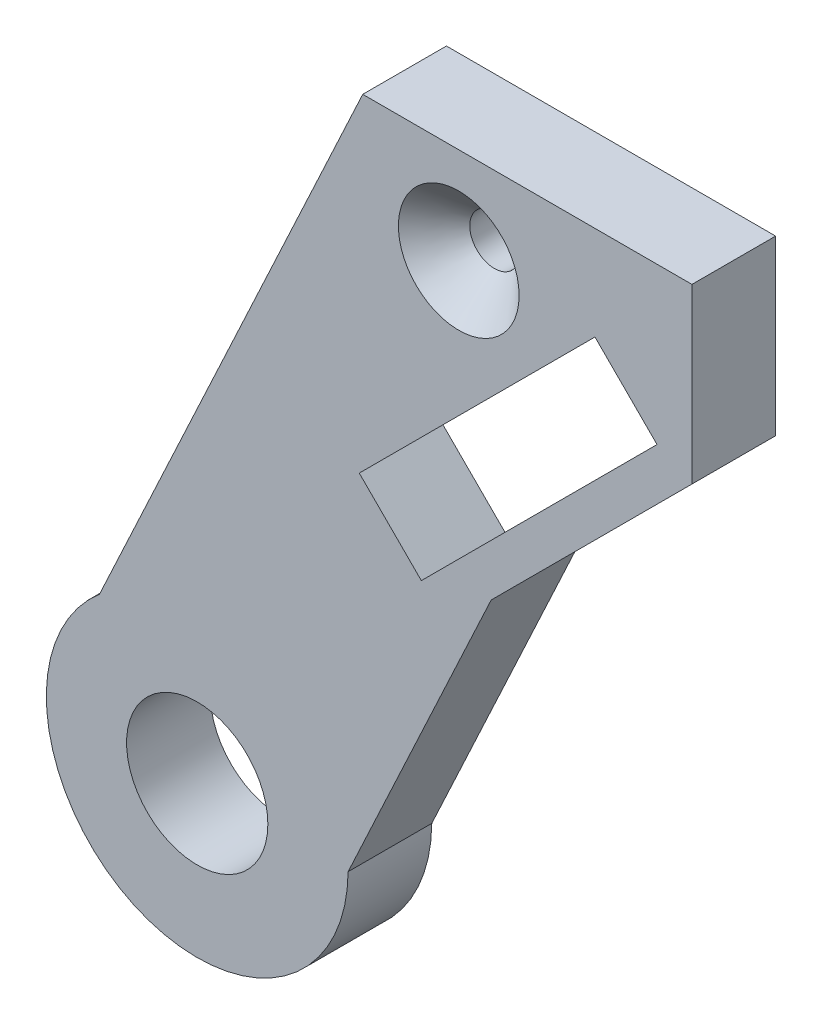
ISO-10303-21;
HEADER;
FILE_DESCRIPTION(('STEP AP214'),'2;1');
FILE_NAME('part.step','',(''),(''),'','','');
FILE_SCHEMA(('AUTOMOTIVE_DESIGN { 1 0 10303 214 1 1 1 1 }'));
ENDSEC;
DATA;
#1=APPLICATION_CONTEXT('core data for automotive mechanical design processes');
#2=APPLICATION_PROTOCOL_DEFINITION('international standard','automotive_design',2000,#1);
#3=PRODUCT_CONTEXT('',#1,'mechanical');
#4=PRODUCT('Part','Part','',(#3));
#5=PRODUCT_RELATED_PRODUCT_CATEGORY('part','',(#4));
#6=PRODUCT_DEFINITION_FORMATION('','',#4);
#7=PRODUCT_DEFINITION_CONTEXT('part definition',#1,'design');
#8=PRODUCT_DEFINITION('design','',#6,#7);
#9=PRODUCT_DEFINITION_SHAPE('','',#8);
#10=(LENGTH_UNIT() NAMED_UNIT(*) SI_UNIT(.MILLI.,.METRE.));
#11=(NAMED_UNIT(*) PLANE_ANGLE_UNIT() SI_UNIT($,.RADIAN.));
#12=(NAMED_UNIT(*) SI_UNIT($,.STERADIAN.) SOLID_ANGLE_UNIT());
#13=UNCERTAINTY_MEASURE_WITH_UNIT(LENGTH_MEASURE(1.E-05),#10,'distance_accuracy_value','');
#14=(GEOMETRIC_REPRESENTATION_CONTEXT(3) GLOBAL_UNCERTAINTY_ASSIGNED_CONTEXT((#13)) GLOBAL_UNIT_ASSIGNED_CONTEXT((#10,
#11,#12)) REPRESENTATION_CONTEXT('',''));
#15=CARTESIAN_POINT('',(0.,0.,0.));
#16=DIRECTION('',(0.,0.,1.));
#17=DIRECTION('',(1.,0.,0.));
#18=AXIS2_PLACEMENT_3D('',#15,#16,#17);
#19=CARTESIAN_POINT('',(3.5,-3.5,3.05));
#20=DIRECTION('',(0.,0.,-1.));
#21=DIRECTION('',(-1.,0.,0.));
#22=AXIS2_PLACEMENT_3D('',#19,#20,#21);
#23=CYLINDRICAL_SURFACE('',#22,0.9);
#24=CARTESIAN_POINT('',(3.5,-3.5,0.));
#25=DIRECTION('',(0.,0.,-1.));
#26=DIRECTION('',(1.,0.,0.));
#27=AXIS2_PLACEMENT_3D('',#24,#25,#26);
#28=CIRCLE('',#27,0.9);
#29=CARTESIAN_POINT('',(4.4,-3.5,0.));
#30=VERTEX_POINT('',#29);
#31=EDGE_CURVE('E159',#30,#30,#28,.T.);
#32=ORIENTED_EDGE('',*,*,#31,.T.);
#33=EDGE_LOOP('',(#32));
#34=FACE_BOUND('',#33,.T.);
#35=CARTESIAN_POINT('',(3.5,-3.5,1.74999999999999));
#36=DIRECTION('',(0.,0.,-1.));
#37=DIRECTION('',(1.,0.,0.));
#38=AXIS2_PLACEMENT_3D('',#35,#36,#37);
#39=CIRCLE('',#38,0.899999999999988);
#40=CARTESIAN_POINT('',(4.39999999999999,-3.5,1.74999999999999));
#41=VERTEX_POINT('',#40);
#42=EDGE_CURVE('E163',#41,#41,#39,.T.);
#43=ORIENTED_EDGE('',*,*,#42,.F.);
#44=EDGE_LOOP('',(#43));
#45=FACE_BOUND('',#44,.T.);
#46=ADVANCED_FACE('F43',(#34,#45),#23,.F.);
#47=CARTESIAN_POINT('',(-6.03391760833418,-24.7707859846198,3.05));
#48=DIRECTION('',(0.,0.,-1.));
#49=DIRECTION('',(-1.,0.,0.));
#50=AXIS2_PLACEMENT_3D('',#47,#48,#49);
#51=CYLINDRICAL_SURFACE('',#50,5.49999999999981);
#52=CARTESIAN_POINT('',(-6.03391760833418,-24.7707859846198,0.));
#53=DIRECTION('',(0.,0.,-1.));
#54=DIRECTION('',(1.,0.,0.));
#55=AXIS2_PLACEMENT_3D('',#52,#53,#54);
#56=CIRCLE('',#55,5.49999999999981);
#57=CARTESIAN_POINT('',(-0.534038585902411,-24.8072652748118,0.));
#58=VERTEX_POINT('',#57);
#59=CARTESIAN_POINT('',(-9.59711645626916,-20.5810826574052,0.));
#60=VERTEX_POINT('',#59);
#61=EDGE_CURVE('E174',#58,#60,#56,.T.);
#62=ORIENTED_EDGE('',*,*,#61,.F.);
#63=DIRECTION('',(0.,0.,-1.));
#64=VECTOR('',#63,1.);
#65=CARTESIAN_POINT('',(-0.534038585902411,-24.8072652748118,3.05));
#66=LINE('',#65,#64);
#67=CARTESIAN_POINT('',(-0.534038585902411,-24.8072652748118,3.05));
#68=VERTEX_POINT('',#67);
#69=EDGE_CURVE('E189',#68,#58,#66,.T.);
#70=ORIENTED_EDGE('',*,*,#69,.F.);
#71=CARTESIAN_POINT('',(-6.03391760833418,-24.7707859846198,3.05));
#72=DIRECTION('',(0.,0.,-1.));
#73=DIRECTION('',(1.,0.,0.));
#74=AXIS2_PLACEMENT_3D('',#71,#72,#73);
#75=CIRCLE('',#74,5.49999999999981);
#76=CARTESIAN_POINT('',(-9.59711645626916,-20.5810826574052,3.05));
#77=VERTEX_POINT('',#76);
#78=EDGE_CURVE('E216',#68,#77,#75,.T.);
#79=ORIENTED_EDGE('',*,*,#78,.T.);
#80=DIRECTION('',(0.,0.,-1.));
#81=VECTOR('',#80,1.);
#82=CARTESIAN_POINT('',(-9.59711645626916,-20.5810826574052,3.05));
#83=LINE('',#82,#81);
#84=EDGE_CURVE('E11',#77,#60,#83,.T.);
#85=ORIENTED_EDGE('',*,*,#84,.T.);
#86=EDGE_LOOP('',(#62,#70,#79,#85));
#87=FACE_BOUND('',#86,.T.);
#88=ADVANCED_FACE('F235',(#87),#51,.T.);
#89=CARTESIAN_POINT('',(0.,0.,3.05));
#90=DIRECTION('',(-0.906307787036648,0.422618261740703,0.));
#91=DIRECTION('',(0.422618261740703,0.906307787036648,0.));
#92=AXIS2_PLACEMENT_3D('',#89,#90,#91);
#93=PLANE('',#92);
#94=DIRECTION('',(-0.422618261740703,-0.906307787036648,0.));
#95=VECTOR('',#94,1.);
#96=CARTESIAN_POINT('',(0.,0.,0.));
#97=LINE('',#96,#95);
#98=CARTESIAN_POINT('',(0.,0.,0.));
#99=VERTEX_POINT('',#98);
#100=EDGE_CURVE('E176',#99,#60,#97,.T.);
#101=ORIENTED_EDGE('',*,*,#100,.T.);
#102=ORIENTED_EDGE('',*,*,#84,.F.);
#103=DIRECTION('',(-0.422618261740703,-0.906307787036648,0.));
#104=VECTOR('',#103,1.);
#105=CARTESIAN_POINT('',(0.,0.,3.05));
#106=LINE('',#105,#104);
#107=CARTESIAN_POINT('',(0.,0.,3.05));
#108=VERTEX_POINT('',#107);
#109=EDGE_CURVE('E150',#108,#77,#106,.T.);
#110=ORIENTED_EDGE('',*,*,#109,.F.);
#111=DIRECTION('',(0.,0.,-1.));
#112=VECTOR('',#111,1.);
#113=CARTESIAN_POINT('',(0.,0.,3.05));
#114=LINE('',#113,#112);
#115=EDGE_CURVE('E52',#108,#99,#114,.T.);
#116=ORIENTED_EDGE('',*,*,#115,.T.);
#117=EDGE_LOOP('',(#101,#102,#110,#116));
#118=FACE_BOUND('',#117,.T.);
#119=ADVANCED_FACE('F231',(#118),#93,.T.);
#120=CARTESIAN_POINT('',(0.,0.,3.05));
#121=DIRECTION('',(0.,-1.,0.));
#122=DIRECTION('',(0.,0.,1.));
#123=AXIS2_PLACEMENT_3D('',#120,#121,#122);
#124=PLANE('',#123);
#125=DIRECTION('',(1.,0.,0.));
#126=VECTOR('',#125,1.);
#127=CARTESIAN_POINT('',(0.,0.,0.));
#128=LINE('',#127,#126);
#129=CARTESIAN_POINT('',(12.,0.,0.));
#130=VERTEX_POINT('',#129);
#131=EDGE_CURVE('E178',#99,#130,#128,.T.);
#132=ORIENTED_EDGE('',*,*,#131,.F.);
#133=ORIENTED_EDGE('',*,*,#115,.F.);
#134=DIRECTION('',(1.,0.,0.));
#135=VECTOR('',#134,1.);
#136=CARTESIAN_POINT('',(0.,0.,3.05));
#137=LINE('',#136,#135);
#138=CARTESIAN_POINT('',(12.,0.,3.05));
#139=VERTEX_POINT('',#138);
#140=EDGE_CURVE('E148',#108,#139,#137,.T.);
#141=ORIENTED_EDGE('',*,*,#140,.T.);
#142=DIRECTION('',(0.,0.,-1.));
#143=VECTOR('',#142,1.);
#144=CARTESIAN_POINT('',(12.,0.,3.05));
#145=LINE('',#144,#143);
#146=EDGE_CURVE('E142',#139,#130,#145,.T.);
#147=ORIENTED_EDGE('',*,*,#146,.T.);
#148=EDGE_LOOP('',(#132,#133,#141,#147));
#149=FACE_BOUND('',#148,.T.);
#150=ADVANCED_FACE('F349',(#149),#124,.F.);
#151=CARTESIAN_POINT('',(12.,0.,3.05));
#152=DIRECTION('',(-1.,0.,0.));
#153=DIRECTION('',(0.,0.,1.));
#154=AXIS2_PLACEMENT_3D('',#151,#152,#153);
#155=PLANE('',#154);
#156=DIRECTION('',(0.,-1.,0.));
#157=VECTOR('',#156,1.);
#158=CARTESIAN_POINT('',(12.,0.,0.));
#159=LINE('',#158,#157);
#160=CARTESIAN_POINT('',(12.,-6.3039086153561,0.));
#161=VERTEX_POINT('',#160);
#162=EDGE_CURVE('E181',#130,#161,#159,.T.);
#163=ORIENTED_EDGE('',*,*,#162,.F.);
#164=ORIENTED_EDGE('',*,*,#146,.F.);
#165=DIRECTION('',(0.,-1.,0.));
#166=VECTOR('',#165,1.);
#167=CARTESIAN_POINT('',(12.,0.,3.05));
#168=LINE('',#167,#166);
#169=CARTESIAN_POINT('',(12.,-6.3039086153561,3.05));
#170=VERTEX_POINT('',#169);
#171=EDGE_CURVE('E132',#139,#170,#168,.T.);
#172=ORIENTED_EDGE('',*,*,#171,.T.);
#173=DIRECTION('',(0.,0.,-1.));
#174=VECTOR('',#173,1.);
#175=CARTESIAN_POINT('',(12.,-6.3039086153561,3.05));
#176=LINE('',#175,#174);
#177=EDGE_CURVE('E137',#170,#161,#176,.T.);
#178=ORIENTED_EDGE('',*,*,#177,.T.);
#179=EDGE_LOOP('',(#163,#164,#172,#178));
#180=FACE_BOUND('',#179,.T.);
#181=ADVANCED_FACE('F145',(#180),#155,.F.);
#182=CARTESIAN_POINT('',(9.15195430767813,-9.15195430767801,3.05));
#183=DIRECTION('',(0.707106781186552,-0.707106781186543,0.));
#184=DIRECTION('',(-0.707106781186543,-0.707106781186552,0.));
#185=AXIS2_PLACEMENT_3D('',#182,#183,#184);
#186=PLANE('',#185);
#187=DIRECTION('',(0.707106781186543,0.707106781186552,0.));
#188=VECTOR('',#187,1.);
#189=CARTESIAN_POINT('',(9.15195430767813,-9.15195430767801,0.));
#190=LINE('',#189,#188);
#191=CARTESIAN_POINT('',(4.68158568563559,-13.6223229297206,0.));
#192=VERTEX_POINT('',#191);
#193=EDGE_CURVE('E139',#192,#161,#190,.T.);
#194=ORIENTED_EDGE('',*,*,#193,.T.);
#195=ORIENTED_EDGE('',*,*,#177,.F.);
#196=DIRECTION('',(0.707106781186543,0.707106781186552,0.));
#197=VECTOR('',#196,1.);
#198=CARTESIAN_POINT('',(9.15195430767813,-9.15195430767801,3.05));
#199=LINE('',#198,#197);
#200=CARTESIAN_POINT('',(4.68158568563559,-13.6223229297206,3.05));
#201=VERTEX_POINT('',#200);
#202=EDGE_CURVE('E127',#201,#170,#199,.T.);
#203=ORIENTED_EDGE('',*,*,#202,.F.);
#204=DIRECTION('',(0.,0.,-1.));
#205=VECTOR('',#204,1.);
#206=CARTESIAN_POINT('',(4.68158568563559,-13.6223229297206,3.05));
#207=LINE('',#206,#205);
#208=EDGE_CURVE('E143',#201,#192,#207,.T.);
#209=ORIENTED_EDGE('',*,*,#208,.T.);
#210=EDGE_LOOP('',(#194,#195,#203,#209));
#211=FACE_BOUND('',#210,.T.);
#212=ADVANCED_FACE('F138',(#211),#186,.T.);
#213=CARTESIAN_POINT('',(2.51749910265625,2.51749910265625,3.05));
#214=DIRECTION('',(-0.707106781186548,-0.707106781186548,0.));
#215=DIRECTION('',(-0.707106781186548,0.707106781186548,0.));
#216=AXIS2_PLACEMENT_3D('',#213,#214,#215);
#217=PLANE('',#216);
#218=DIRECTION('',(0.707106781186548,-0.707106781186548,0.));
#219=VECTOR('',#218,1.);
#220=CARTESIAN_POINT('',(2.51749910265625,2.51749910265625,0.));
#221=LINE('',#220,#219);
#222=CARTESIAN_POINT('',(8.46446609406726,-3.42946788875476,0.));
#223=VERTEX_POINT('',#222);
#224=CARTESIAN_POINT('',(10.7272077938642,-5.6922095885517,0.));
#225=VERTEX_POINT('',#224);
#226=EDGE_CURVE('E162',#223,#225,#221,.T.);
#227=ORIENTED_EDGE('',*,*,#226,.T.);
#228=DIRECTION('',(0.,0.,-1.));
#229=VECTOR('',#228,1.);
#230=CARTESIAN_POINT('',(10.7272077938642,-5.6922095885517,3.05));
#231=LINE('',#230,#229);
#232=CARTESIAN_POINT('',(10.7272077938642,-5.6922095885517,3.05));
#233=VERTEX_POINT('',#232);
#234=EDGE_CURVE('E158',#233,#225,#231,.T.);
#235=ORIENTED_EDGE('',*,*,#234,.F.);
#236=DIRECTION('',(0.707106781186548,-0.707106781186548,0.));
#237=VECTOR('',#236,1.);
#238=CARTESIAN_POINT('',(2.51749910265625,2.51749910265625,3.05));
#239=LINE('',#238,#237);
#240=CARTESIAN_POINT('',(8.46446609406726,-3.42946788875476,3.05));
#241=VERTEX_POINT('',#240);
#242=EDGE_CURVE('E188',#241,#233,#239,.T.);
#243=ORIENTED_EDGE('',*,*,#242,.F.);
#244=DIRECTION('',(0.,0.,-1.));
#245=VECTOR('',#244,1.);
#246=CARTESIAN_POINT('',(8.46446609406726,-3.42946788875476,3.05));
#247=LINE('',#246,#245);
#248=EDGE_CURVE('E46',#241,#223,#247,.T.);
#249=ORIENTED_EDGE('',*,*,#248,.T.);
#250=EDGE_LOOP('',(#227,#235,#243,#249));
#251=FACE_BOUND('',#250,.T.);
#252=ADVANCED_FACE('F207',(#251),#217,.T.);
#253=CARTESIAN_POINT('',(5.94696699141101,-5.94696699141101,3.05));
#254=DIRECTION('',(-0.707106781186547,0.707106781186548,0.));
#255=DIRECTION('',(0.707106781186548,0.707106781186547,0.));
#256=AXIS2_PLACEMENT_3D('',#253,#254,#255);
#257=PLANE('',#256);
#258=DIRECTION('',(-0.707106781186548,-0.707106781186547,0.));
#259=VECTOR('',#258,1.);
#260=CARTESIAN_POINT('',(5.94696699141101,-5.94696699141101,0.));
#261=LINE('',#260,#259);
#262=CARTESIAN_POINT('',(-0.126881297349292,-12.0208152801713,0.));
#263=VERTEX_POINT('',#262);
#264=EDGE_CURVE('E166',#223,#263,#261,.T.);
#265=ORIENTED_EDGE('',*,*,#264,.F.);
#266=ORIENTED_EDGE('',*,*,#248,.F.);
#267=DIRECTION('',(-0.707106781186548,-0.707106781186547,0.));
#268=VECTOR('',#267,1.);
#269=CARTESIAN_POINT('',(5.94696699141101,-5.94696699141101,3.05));
#270=LINE('',#269,#268);
#271=CARTESIAN_POINT('',(-0.126881297349292,-12.0208152801713,3.05));
#272=VERTEX_POINT('',#271);
#273=EDGE_CURVE('E106',#241,#272,#270,.T.);
#274=ORIENTED_EDGE('',*,*,#273,.T.);
#275=DIRECTION('',(0.,0.,-1.));
#276=VECTOR('',#275,1.);
#277=CARTESIAN_POINT('',(-0.126881297349292,-12.0208152801713,3.05));
#278=LINE('',#277,#276);
#279=EDGE_CURVE('E199',#272,#263,#278,.T.);
#280=ORIENTED_EDGE('',*,*,#279,.T.);
#281=EDGE_LOOP('',(#265,#266,#274,#280));
#282=FACE_BOUND('',#281,.T.);
#283=ADVANCED_FACE('F246',(#282),#257,.F.);
#284=CARTESIAN_POINT('',(-6.0738482887603,-6.0738482887603,3.05));
#285=DIRECTION('',(-0.707106781186547,-0.707106781186548,0.));
#286=DIRECTION('',(-0.707106781186548,0.707106781186547,0.));
#287=AXIS2_PLACEMENT_3D('',#284,#285,#286);
#288=PLANE('',#287);
#289=DIRECTION('',(0.707106781186548,-0.707106781186547,0.));
#290=VECTOR('',#289,1.);
#291=CARTESIAN_POINT('',(-6.0738482887603,-6.0738482887603,0.));
#292=LINE('',#291,#290);
#293=CARTESIAN_POINT('',(2.13586040244766,-14.2835569799683,0.));
#294=VERTEX_POINT('',#293);
#295=EDGE_CURVE('E169',#263,#294,#292,.T.);
#296=ORIENTED_EDGE('',*,*,#295,.F.);
#297=ORIENTED_EDGE('',*,*,#279,.F.);
#298=DIRECTION('',(0.707106781186548,-0.707106781186547,0.));
#299=VECTOR('',#298,1.);
#300=CARTESIAN_POINT('',(-6.0738482887603,-6.0738482887603,3.05));
#301=LINE('',#300,#299);
#302=CARTESIAN_POINT('',(2.13586040244766,-14.2835569799683,3.05));
#303=VERTEX_POINT('',#302);
#304=EDGE_CURVE('E217',#272,#303,#301,.T.);
#305=ORIENTED_EDGE('',*,*,#304,.T.);
#306=DIRECTION('',(0.,0.,-1.));
#307=VECTOR('',#306,1.);
#308=CARTESIAN_POINT('',(2.13586040244766,-14.2835569799683,3.05));
#309=LINE('',#308,#307);
#310=EDGE_CURVE('E197',#303,#294,#309,.T.);
#311=ORIENTED_EDGE('',*,*,#310,.T.);
#312=EDGE_LOOP('',(#296,#297,#305,#311));
#313=FACE_BOUND('',#312,.T.);
#314=ADVANCED_FACE('F238',(#313),#288,.F.);
#315=CARTESIAN_POINT('',(9.0630778703663,-4.22618261740677,3.05));
#316=DIRECTION('',(0.906307787036655,-0.422618261740689,0.));
#317=DIRECTION('',(-0.422618261740689,-0.906307787036655,0.));
#318=AXIS2_PLACEMENT_3D('',#315,#316,#317);
#319=PLANE('',#318);
#320=DIRECTION('',(0.422618261740689,0.906307787036655,0.));
#321=VECTOR('',#320,1.);
#322=CARTESIAN_POINT('',(9.0630778703663,-4.22618261740677,0.));
#323=LINE('',#322,#321);
#324=EDGE_CURVE('E93',#58,#192,#323,.T.);
#325=ORIENTED_EDGE('',*,*,#324,.T.);
#326=ORIENTED_EDGE('',*,*,#208,.F.);
#327=DIRECTION('',(0.422618261740689,0.906307787036655,0.));
#328=VECTOR('',#327,1.);
#329=CARTESIAN_POINT('',(9.0630778703663,-4.22618261740677,3.05));
#330=LINE('',#329,#328);
#331=EDGE_CURVE('E61',#68,#201,#330,.T.);
#332=ORIENTED_EDGE('',*,*,#331,.F.);
#333=ORIENTED_EDGE('',*,*,#69,.T.);
#334=EDGE_LOOP('',(#325,#326,#332,#333));
#335=FACE_BOUND('',#334,.T.);
#336=ADVANCED_FACE('F236',(#335),#319,.T.);
#337=CARTESIAN_POINT('',(8.20970869120796,-8.20970869120796,3.05));
#338=DIRECTION('',(0.707106781186548,-0.707106781186548,0.));
#339=DIRECTION('',(-0.707106781186548,-0.707106781186548,0.));
#340=AXIS2_PLACEMENT_3D('',#337,#338,#339);
#341=PLANE('',#340);
#342=DIRECTION('',(0.707106781186548,0.707106781186548,0.));
#343=VECTOR('',#342,1.);
#344=CARTESIAN_POINT('',(8.20970869120796,-8.20970869120796,0.));
#345=LINE('',#344,#343);
#346=EDGE_CURVE('E172',#294,#225,#345,.T.);
#347=ORIENTED_EDGE('',*,*,#346,.F.);
#348=ORIENTED_EDGE('',*,*,#310,.F.);
#349=DIRECTION('',(0.707106781186548,0.707106781186548,0.));
#350=VECTOR('',#349,1.);
#351=CARTESIAN_POINT('',(8.20970869120796,-8.20970869120796,3.05));
#352=LINE('',#351,#350);
#353=EDGE_CURVE('E214',#303,#233,#352,.T.);
#354=ORIENTED_EDGE('',*,*,#353,.T.);
#355=ORIENTED_EDGE('',*,*,#234,.T.);
#356=EDGE_LOOP('',(#347,#348,#354,#355));
#357=FACE_BOUND('',#356,.T.);
#358=ADVANCED_FACE('F213',(#357),#341,.F.);
#359=CARTESIAN_POINT('',(-6.03391760833418,-24.7707859846198,3.05));
#360=DIRECTION('',(0.,0.,-1.));
#361=DIRECTION('',(-1.,0.,0.));
#362=AXIS2_PLACEMENT_3D('',#359,#360,#361);
#363=CYLINDRICAL_SURFACE('',#362,2.57499999999981);
#364=CARTESIAN_POINT('',(-6.03391760833418,-24.7707859846198,3.05));
#365=DIRECTION('',(0.,0.,-1.));
#366=DIRECTION('',(1.,0.,0.));
#367=AXIS2_PLACEMENT_3D('',#364,#365,#366);
#368=CIRCLE('',#367,2.57499999999981);
#369=CARTESIAN_POINT('',(-3.45891760833437,-24.7707859846198,3.05));
#370=VERTEX_POINT('',#369);
#371=EDGE_CURVE('E155',#370,#370,#368,.T.);
#372=ORIENTED_EDGE('',*,*,#371,.F.);
#373=EDGE_LOOP('',(#372));
#374=FACE_BOUND('',#373,.T.);
#375=CARTESIAN_POINT('',(-6.03391760833418,-24.7707859846198,0.));
#376=DIRECTION('',(0.,0.,-1.));
#377=DIRECTION('',(1.,0.,0.));
#378=AXIS2_PLACEMENT_3D('',#375,#376,#377);
#379=CIRCLE('',#378,2.57499999999981);
#380=CARTESIAN_POINT('',(-3.45891760833437,-24.7707859846198,0.));
#381=VERTEX_POINT('',#380);
#382=EDGE_CURVE('E185',#381,#381,#379,.T.);
#383=ORIENTED_EDGE('',*,*,#382,.T.);
#384=EDGE_LOOP('',(#383));
#385=FACE_BOUND('',#384,.T.);
#386=ADVANCED_FACE('F244',(#374,#385),#363,.F.);
#387=CARTESIAN_POINT('',(0.,0.,3.05));
#388=DIRECTION('',(0.,0.,1.));
#389=DIRECTION('',(1.,0.,0.));
#390=AXIS2_PLACEMENT_3D('',#387,#388,#389);
#391=PLANE('',#390);
#392=CARTESIAN_POINT('',(3.5,-3.5,3.05));
#393=DIRECTION('',(0.,0.,-1.));
#394=DIRECTION('',(1.,0.,0.));
#395=AXIS2_PLACEMENT_3D('',#392,#393,#394);
#396=CIRCLE('',#395,2.2);
#397=CARTESIAN_POINT('',(5.7,-3.5,3.05));
#398=VERTEX_POINT('',#397);
#399=EDGE_CURVE('E262',#398,#398,#396,.T.);
#400=ORIENTED_EDGE('',*,*,#399,.T.);
#401=EDGE_LOOP('',(#400));
#402=FACE_BOUND('',#401,.T.);
#403=ORIENTED_EDGE('',*,*,#242,.T.);
#404=ORIENTED_EDGE('',*,*,#353,.F.);
#405=ORIENTED_EDGE('',*,*,#304,.F.);
#406=ORIENTED_EDGE('',*,*,#273,.F.);
#407=EDGE_LOOP('',(#403,#404,#405,#406));
#408=FACE_BOUND('',#407,.T.);
#409=ORIENTED_EDGE('',*,*,#78,.F.);
#410=ORIENTED_EDGE('',*,*,#331,.T.);
#411=ORIENTED_EDGE('',*,*,#202,.T.);
#412=ORIENTED_EDGE('',*,*,#171,.F.);
#413=ORIENTED_EDGE('',*,*,#140,.F.);
#414=ORIENTED_EDGE('',*,*,#109,.T.);
#415=EDGE_LOOP('',(#409,#410,#411,#412,#413,#414));
#416=FACE_BOUND('',#415,.T.);
#417=ORIENTED_EDGE('',*,*,#371,.T.);
#418=EDGE_LOOP('',(#417));
#419=FACE_BOUND('',#418,.T.);
#420=ADVANCED_FACE('F129',(#402,#408,#416,#419),#391,.T.);
#421=CARTESIAN_POINT('',(0.,0.,0.));
#422=DIRECTION('',(0.,0.,1.));
#423=DIRECTION('',(1.,0.,0.));
#424=AXIS2_PLACEMENT_3D('',#421,#422,#423);
#425=PLANE('',#424);
#426=ORIENTED_EDGE('',*,*,#31,.F.);
#427=EDGE_LOOP('',(#426));
#428=FACE_BOUND('',#427,.T.);
#429=ORIENTED_EDGE('',*,*,#226,.F.);
#430=ORIENTED_EDGE('',*,*,#264,.T.);
#431=ORIENTED_EDGE('',*,*,#295,.T.);
#432=ORIENTED_EDGE('',*,*,#346,.T.);
#433=EDGE_LOOP('',(#429,#430,#431,#432));
#434=FACE_BOUND('',#433,.T.);
#435=ORIENTED_EDGE('',*,*,#61,.T.);
#436=ORIENTED_EDGE('',*,*,#100,.F.);
#437=ORIENTED_EDGE('',*,*,#131,.T.);
#438=ORIENTED_EDGE('',*,*,#162,.T.);
#439=ORIENTED_EDGE('',*,*,#193,.F.);
#440=ORIENTED_EDGE('',*,*,#324,.F.);
#441=EDGE_LOOP('',(#435,#436,#437,#438,#439,#440));
#442=FACE_BOUND('',#441,.T.);
#443=ORIENTED_EDGE('',*,*,#382,.F.);
#444=EDGE_LOOP('',(#443));
#445=FACE_BOUND('',#444,.T.);
#446=ADVANCED_FACE('F210',(#428,#434,#442,#445),#425,.F.);
#447=CARTESIAN_POINT('',(3.5,-3.5,3.05));
#448=DIRECTION('',(0.,0.,1.));
#449=DIRECTION('',(1.,0.,0.));
#450=AXIS2_PLACEMENT_3D('',#447,#448,#449);
#451=CONICAL_SURFACE('',#450,2.2,0.785398163397449);
#452=ORIENTED_EDGE('',*,*,#42,.T.);
#453=EDGE_LOOP('',(#452));
#454=FACE_BOUND('',#453,.T.);
#455=ORIENTED_EDGE('',*,*,#399,.F.);
#456=EDGE_LOOP('',(#455));
#457=FACE_BOUND('',#456,.T.);
#458=ADVANCED_FACE('F267',(#454,#457),#451,.F.);
#459=CLOSED_SHELL('',(#46,#88,#119,#150,#181,#212,#252,#283,#314,#336,#358,#386,#420,#446,#458));
#460=MANIFOLD_SOLID_BREP('B2',#459);
#461=ADVANCED_BREP_SHAPE_REPRESENTATION('',(#18,#460),#14);
#462=SHAPE_DEFINITION_REPRESENTATION(#9,#461);
ENDSEC;
END-ISO-10303-21;
